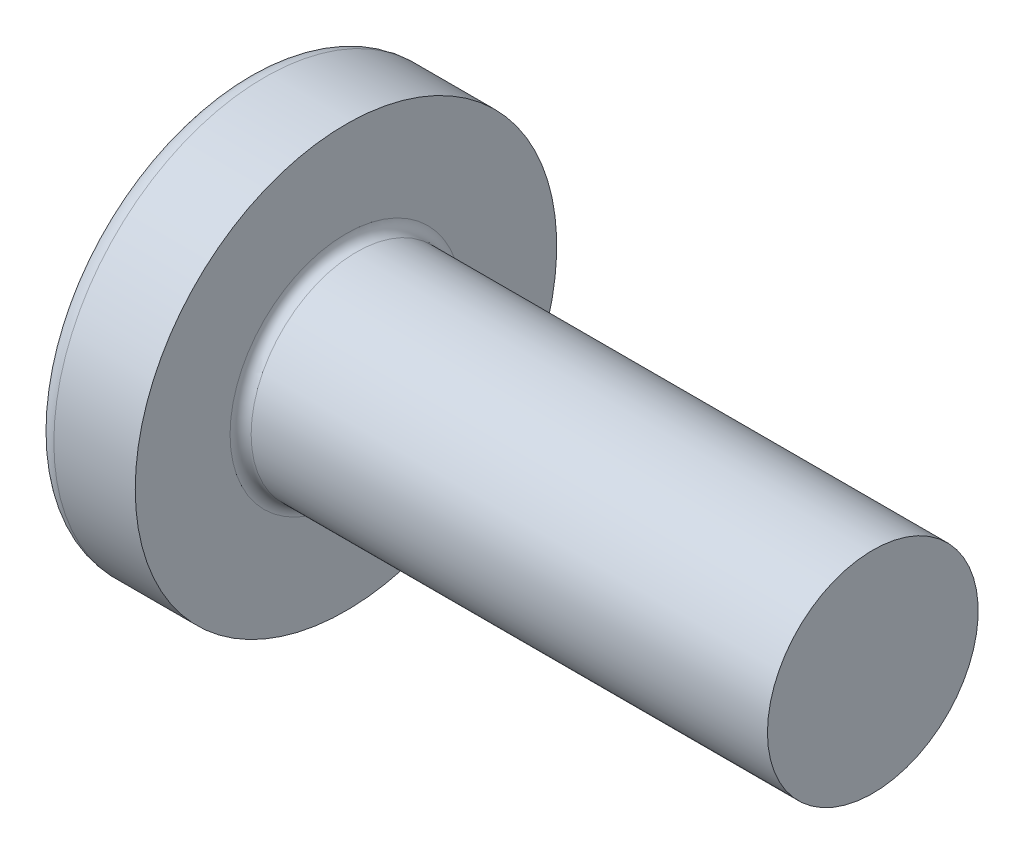
ISO-10303-21;
HEADER;
FILE_DESCRIPTION(('STEP AP214'),'2;1');
FILE_NAME('part.step','',(''),(''),'','','');
FILE_SCHEMA(('AUTOMOTIVE_DESIGN { 1 0 10303 214 1 1 1 1 }'));
ENDSEC;
DATA;
#1=APPLICATION_CONTEXT('core data for automotive mechanical design processes');
#2=APPLICATION_PROTOCOL_DEFINITION('international standard','automotive_design',2000,#1);
#3=PRODUCT_CONTEXT('',#1,'mechanical');
#4=PRODUCT('Part','Part','',(#3));
#5=PRODUCT_RELATED_PRODUCT_CATEGORY('part','',(#4));
#6=PRODUCT_DEFINITION_FORMATION('','',#4);
#7=PRODUCT_DEFINITION_CONTEXT('part definition',#1,'design');
#8=PRODUCT_DEFINITION('design','',#6,#7);
#9=PRODUCT_DEFINITION_SHAPE('','',#8);
#10=(LENGTH_UNIT() NAMED_UNIT(*) SI_UNIT(.MILLI.,.METRE.));
#11=(NAMED_UNIT(*) PLANE_ANGLE_UNIT() SI_UNIT($,.RADIAN.));
#12=(NAMED_UNIT(*) SI_UNIT($,.STERADIAN.) SOLID_ANGLE_UNIT());
#13=UNCERTAINTY_MEASURE_WITH_UNIT(LENGTH_MEASURE(1.E-05),#10,'distance_accuracy_value','');
#14=(GEOMETRIC_REPRESENTATION_CONTEXT(3) GLOBAL_UNCERTAINTY_ASSIGNED_CONTEXT((#13)) GLOBAL_UNIT_ASSIGNED_CONTEXT((#10,
#11,#12)) REPRESENTATION_CONTEXT('',''));
#15=CARTESIAN_POINT('',(0.,0.,0.));
#16=DIRECTION('',(0.,0.,1.));
#17=DIRECTION('',(1.,0.,0.));
#18=AXIS2_PLACEMENT_3D('',#15,#16,#17);
#19=CARTESIAN_POINT('',(6.5,0.,0.));
#20=DIRECTION('',(-1.,0.,0.));
#21=DIRECTION('',(0.,1.,0.));
#22=AXIS2_PLACEMENT_3D('',#19,#20,#21);
#23=SPHERICAL_SURFACE('',#22,6.5);
#24=CARTESIAN_POINT('',(1.26538895452803,0.,0.));
#25=DIRECTION('',(-1.,0.,0.));
#26=DIRECTION('',(0.,0.,1.));
#27=AXIS2_PLACEMENT_3D('',#24,#25,#26);
#28=CIRCLE('',#27,3.85342019543974);
#29=CARTESIAN_POINT('',(1.26538895452803,0.,3.85342019543974));
#30=VERTEX_POINT('',#29);
#31=EDGE_CURVE('E209',#30,#30,#28,.T.);
#32=ORIENTED_EDGE('',*,*,#31,.T.);
#33=EDGE_LOOP('',(#32));
#34=FACE_BOUND('',#33,.T.);
#35=CARTESIAN_POINT('',(0.0788099820016241,0.,0.));
#36=DIRECTION('',(1.,0.,0.));
#37=DIRECTION('',(0.,0.,-1.));
#38=AXIS2_PLACEMENT_3D('',#35,#36,#37);
#39=CIRCLE('',#38,1.0091178091571);
#40=CARTESIAN_POINT('',(0.0788099820016234,-0.514999999999996,-0.867809744562726));
#41=VERTEX_POINT('',#40);
#42=CARTESIAN_POINT('',(0.0788099820016241,-0.867809744562728,-0.515));
#43=VERTEX_POINT('',#42);
#44=EDGE_CURVE('E398',#41,#43,#39,.F.);
#45=ORIENTED_EDGE('',*,*,#44,.F.);
#46=CARTESIAN_POINT('',(6.5,-0.515000000000001,0.));
#47=DIRECTION('',(0.,1.,0.));
#48=DIRECTION('',(0.,0.,1.));
#49=AXIS2_PLACEMENT_3D('',#46,#47,#48);
#50=CIRCLE('',#49,6.47956595768575);
#51=CARTESIAN_POINT('',(0.331830514069449,-0.514999999999992,-1.98455541440274));
#52=VERTEX_POINT('',#51);
#53=EDGE_CURVE('E254',#52,#41,#50,.T.);
#54=ORIENTED_EDGE('',*,*,#53,.F.);
#55=CARTESIAN_POINT('',(6.06443205224295,0.,0.873614180207961));
#56=DIRECTION('',(0.446197800778958,0.,-0.89493436774996));
#57=DIRECTION('',(-0.89493436774996,0.,-0.446197800778958));
#58=AXIS2_PLACEMENT_3D('',#55,#56,#57);
#59=CIRCLE('',#58,6.4262803258982);
#60=CARTESIAN_POINT('',(0.331830514069448,0.515000000000007,-1.98455541440274));
#61=VERTEX_POINT('',#60);
#62=EDGE_CURVE('E228',#52,#61,#59,.T.);
#63=ORIENTED_EDGE('',*,*,#62,.T.);
#64=CARTESIAN_POINT('',(6.5,0.515,0.));
#65=DIRECTION('',(0.,-1.,0.));
#66=DIRECTION('',(0.,0.,-1.));
#67=AXIS2_PLACEMENT_3D('',#64,#65,#66);
#68=CIRCLE('',#67,6.47956595768574);
#69=CARTESIAN_POINT('',(0.0788099820016247,0.515000000000003,-0.867809744562722));
#70=VERTEX_POINT('',#69);
#71=EDGE_CURVE('E262',#70,#61,#68,.T.);
#72=ORIENTED_EDGE('',*,*,#71,.F.);
#73=CARTESIAN_POINT('',(0.0788099820016241,0.867809744562718,-0.515));
#74=VERTEX_POINT('',#73);
#75=EDGE_CURVE('E330',#74,#70,#39,.F.);
#76=ORIENTED_EDGE('',*,*,#75,.F.);
#77=CARTESIAN_POINT('',(6.5,0.,-0.515));
#78=DIRECTION('',(0.,0.,1.));
#79=DIRECTION('',(1.,0.,0.));
#80=AXIS2_PLACEMENT_3D('',#77,#78,#79);
#81=CIRCLE('',#80,6.47956595768574);
#82=CARTESIAN_POINT('',(0.331830514069449,1.98455541440274,-0.515));
#83=VERTEX_POINT('',#82);
#84=EDGE_CURVE('E222',#83,#74,#81,.T.);
#85=ORIENTED_EDGE('',*,*,#84,.F.);
#86=CARTESIAN_POINT('',(6.06443205224295,-0.873614180207962,0.));
#87=DIRECTION('',(0.446197800778958,0.89493436774996,0.));
#88=DIRECTION('',(-0.89493436774996,0.446197800778958,0.));
#89=AXIS2_PLACEMENT_3D('',#86,#87,#88);
#90=CIRCLE('',#89,6.4262803258982);
#91=CARTESIAN_POINT('',(0.331830514069449,1.98455541440274,0.515));
#92=VERTEX_POINT('',#91);
#93=EDGE_CURVE('E225',#83,#92,#90,.T.);
#94=ORIENTED_EDGE('',*,*,#93,.T.);
#95=CARTESIAN_POINT('',(6.5,0.,0.515));
#96=DIRECTION('',(0.,0.,-1.));
#97=DIRECTION('',(-1.,0.,0.));
#98=AXIS2_PLACEMENT_3D('',#95,#96,#97);
#99=CIRCLE('',#98,6.47956595768574);
#100=CARTESIAN_POINT('',(0.0788099820016241,0.867809744562718,0.514999999999999));
#101=VERTEX_POINT('',#100);
#102=EDGE_CURVE('E218',#101,#92,#99,.T.);
#103=ORIENTED_EDGE('',*,*,#102,.F.);
#104=CARTESIAN_POINT('',(0.0788099820016251,0.514999999999997,0.867809744562726));
#105=VERTEX_POINT('',#104);
#106=EDGE_CURVE('E360',#105,#101,#39,.F.);
#107=ORIENTED_EDGE('',*,*,#106,.F.);
#108=CARTESIAN_POINT('',(0.331830514069448,0.514999999999993,1.98455541440274));
#109=VERTEX_POINT('',#108);
#110=EDGE_CURVE('E238',#109,#105,#68,.T.);
#111=ORIENTED_EDGE('',*,*,#110,.F.);
#112=CARTESIAN_POINT('',(6.06443205224295,0.,-0.873614180207961));
#113=DIRECTION('',(0.446197800778958,0.,0.89493436774996));
#114=DIRECTION('',(0.89493436774996,0.,-0.446197800778958));
#115=AXIS2_PLACEMENT_3D('',#112,#113,#114);
#116=CIRCLE('',#115,6.4262803258982);
#117=CARTESIAN_POINT('',(0.331830514069448,-0.515000000000007,1.98455541440274));
#118=VERTEX_POINT('',#117);
#119=EDGE_CURVE('E46',#109,#118,#116,.T.);
#120=ORIENTED_EDGE('',*,*,#119,.T.);
#121=CARTESIAN_POINT('',(0.0788099820016234,-0.515000000000003,0.867809744562723));
#122=VERTEX_POINT('',#121);
#123=EDGE_CURVE('E235',#122,#118,#50,.T.);
#124=ORIENTED_EDGE('',*,*,#123,.F.);
#125=CARTESIAN_POINT('',(0.0788099820016241,-0.867809744562728,0.514999999999999));
#126=VERTEX_POINT('',#125);
#127=EDGE_CURVE('E394',#126,#122,#39,.F.);
#128=ORIENTED_EDGE('',*,*,#127,.F.);
#129=CARTESIAN_POINT('',(0.331830514069448,-1.98455541440274,0.514999999999999));
#130=VERTEX_POINT('',#129);
#131=EDGE_CURVE('E219',#130,#126,#99,.T.);
#132=ORIENTED_EDGE('',*,*,#131,.F.);
#133=CARTESIAN_POINT('',(6.06443205224295,0.87361418020796,0.));
#134=DIRECTION('',(0.446197800778958,-0.89493436774996,0.));
#135=DIRECTION('',(0.89493436774996,0.446197800778958,0.));
#136=AXIS2_PLACEMENT_3D('',#133,#134,#135);
#137=CIRCLE('',#136,6.4262803258982);
#138=CARTESIAN_POINT('',(0.331830514069447,-1.98455541440274,-0.515));
#139=VERTEX_POINT('',#138);
#140=EDGE_CURVE('E215',#130,#139,#137,.T.);
#141=ORIENTED_EDGE('',*,*,#140,.T.);
#142=EDGE_CURVE('E61',#43,#139,#81,.T.);
#143=ORIENTED_EDGE('',*,*,#142,.F.);
#144=EDGE_LOOP('',(#45,#54,#63,#72,#76,#85,#94,#103,#107,#111,#120,#124,#128,#132,#141,#143));
#145=FACE_BOUND('',#144,.T.);
#146=ADVANCED_FACE('F33',(#34,#145),#23,.T.);
#147=CARTESIAN_POINT('',(0.,2.15,-0.515));
#148=DIRECTION('',(0.,0.,1.));
#149=DIRECTION('',(1.,0.,0.));
#150=AXIS2_PLACEMENT_3D('',#147,#148,#149);
#151=PLANE('',#150);
#152=ORIENTED_EDGE('',*,*,#84,.T.);
#153=CARTESIAN_POINT('',(-1.51195208675156,0.994972220320186,-0.515));
#154=CARTESIAN_POINT('',(-1.20405981949279,0.970722016949956,-0.515));
#155=CARTESIAN_POINT('',(-0.896180907521171,0.946299109919649,-0.515));
#156=CARTESIAN_POINT('',(-0.280449079832184,0.89698112242785,-0.515));
#157=CARTESIAN_POINT('',(0.0274038344396877,0.872086023934881,-0.515));
#158=CARTESIAN_POINT('',(0.489146739515351,0.834295535195278,-0.515));
#159=CARTESIAN_POINT('',(0.643055047553846,0.821624058404091,-0.515));
#160=CARTESIAN_POINT('',(0.95085652019714,0.796108332639503,-0.515));
#161=CARTESIAN_POINT('',(1.10474968487868,0.783264084592464,-0.515));
#162=CARTESIAN_POINT('',(1.41251352095103,0.757376569093377,-0.515));
#163=CARTESIAN_POINT('',(1.56638419296577,0.744333309065217,-0.515));
#164=CARTESIAN_POINT('',(1.87410847343335,0.718013273188894,-0.515));
#165=CARTESIAN_POINT('',(2.02796208151372,0.70473649298279,-0.515));
#166=CARTESIAN_POINT('',(2.36455311890988,0.675386943006725,-0.515));
#167=CARTESIAN_POINT('',(2.54728562293342,0.659257575640984,-0.515));
#168=CARTESIAN_POINT('',(2.91270624109256,0.626517182479886,-0.515));
#169=CARTESIAN_POINT('',(3.09539435554037,0.609906160177237,-0.515));
#170=CARTESIAN_POINT('',(3.46069832191612,0.57607302711642,-0.515));
#171=CARTESIAN_POINT('',(3.64331417870068,0.558850968932726,-0.515));
#172=CARTESIAN_POINT('',(4.00847437496567,0.523604864540035,-0.515));
#173=CARTESIAN_POINT('',(4.19101871216888,0.505580794604251,-0.515));
#174=CARTESIAN_POINT('',(4.55606208157937,0.468429191666486,-0.515));
#175=CARTESIAN_POINT('',(4.73856107358022,0.449301262281852,-0.515));
#176=CARTESIAN_POINT('',(5.10337547353418,0.409473604748923,-0.515));
#177=CARTESIAN_POINT('',(5.28569089526422,0.388774005106068,-0.515));
#178=CARTESIAN_POINT('',(5.55897278495412,0.355828287527262,-0.515));
#179=CARTESIAN_POINT('',(5.65005277419686,0.344527918782736,-0.515));
#180=CARTESIAN_POINT('',(5.83209904103607,0.321075174263029,-0.515));
#181=CARTESIAN_POINT('',(5.92306532397915,0.308922840209684,-0.515));
#182=CARTESIAN_POINT('',(6.10486078872898,0.283427334451928,-0.515));
#183=CARTESIAN_POINT('',(6.19568992299379,0.270083817601712,-0.515));
#184=CARTESIAN_POINT('',(6.33172773785679,0.248701420809948,-0.515));
#185=CARTESIAN_POINT('',(6.37704304473344,0.241345446705302,-0.515));
#186=CARTESIAN_POINT('',(6.46757225201409,0.226018953559335,-0.515));
#187=CARTESIAN_POINT('',(6.51278614568082,0.218048394864474,-0.515));
#188=CARTESIAN_POINT('',(6.55793125759548,0.209691465274942,-0.515));
#189=B_SPLINE_CURVE_WITH_KNOTS('',3,(#153,#154,#155,#156,#157,#158,#159,#160,#161,#162,#163,
#164,#165,#166,#167,#168,#169,#170,#171,#172,#173,#174,#175,#176,#177,#178,#179,#180,#181,#182,
#183,#184,#185,#186,#187,#188),.UNSPECIFIED.,.F.,.F.,(4,2,2,2,2,2,2,2,2,2,2,2,2,2,2,2,2,4),(0.,
0.92653770978172,1.85311087258339,2.31639796016284,2.7796825646877,3.24294992902054,
3.70622594801777,4.25655436065378,4.80687878359543,5.35715597005738,5.90744944680717,
6.45794177197673,7.00838913527399,7.28372117336898,7.5590397375059,7.83443833587748,
7.97216007460854,8.1098907067157),.UNSPECIFIED.);
#190=CARTESIAN_POINT('',(2.34,0.677477674908921,-0.515));
#191=VERTEX_POINT('',#190);
#192=EDGE_CURVE('E323',#74,#191,#189,.T.);
#193=ORIENTED_EDGE('',*,*,#192,.T.);
#194=DIRECTION('',(0.,1.,0.));
#195=VECTOR('',#194,1.);
#196=CARTESIAN_POINT('',(2.34,-0.983319077411408,-0.515));
#197=LINE('',#196,#195);
#198=CARTESIAN_POINT('',(2.34,0.983319077411408,-0.515));
#199=VERTEX_POINT('',#198);
#200=EDGE_CURVE('E277',#191,#199,#197,.T.);
#201=ORIENTED_EDGE('',*,*,#200,.T.);
#202=DIRECTION('',(0.89493436774996,-0.446197800778958,0.));
#203=VECTOR('',#202,1.);
#204=CARTESIAN_POINT('',(0.,2.15,-0.515));
#205=LINE('',#204,#203);
#206=EDGE_CURVE('E283',#83,#199,#205,.T.);
#207=ORIENTED_EDGE('',*,*,#206,.F.);
#208=EDGE_LOOP('',(#152,#193,#201,#207));
#209=FACE_BOUND('',#208,.T.);
#210=ADVANCED_FACE('F167',(#209),#151,.T.);
#211=CARTESIAN_POINT('',(2.34,-0.983319077411408,-0.515));
#212=VERTEX_POINT('',#211);
#213=CARTESIAN_POINT('',(2.34,-0.677477674908921,-0.515));
#214=VERTEX_POINT('',#213);
#215=EDGE_CURVE('E274',#212,#214,#197,.T.);
#216=ORIENTED_EDGE('',*,*,#215,.T.);
#217=CARTESIAN_POINT('',(-1.51195208675156,-0.994972220320186,-0.515));
#218=CARTESIAN_POINT('',(-1.20405981949279,-0.970722016949956,-0.515));
#219=CARTESIAN_POINT('',(-0.896180907521173,-0.946299109919649,-0.515));
#220=CARTESIAN_POINT('',(-0.280449079832185,-0.89698112242785,-0.515));
#221=CARTESIAN_POINT('',(0.0274038344396871,-0.872086023934881,-0.515));
#222=CARTESIAN_POINT('',(0.48914673951535,-0.834295535195279,-0.515));
#223=CARTESIAN_POINT('',(0.643055047553845,-0.821624058404091,-0.515));
#224=CARTESIAN_POINT('',(0.95085652019714,-0.796108332639502,-0.515));
#225=CARTESIAN_POINT('',(1.10474968487868,-0.783264084592464,-0.515));
#226=CARTESIAN_POINT('',(1.41251352095103,-0.757376569093377,-0.515));
#227=CARTESIAN_POINT('',(1.56638419296577,-0.744333309065217,-0.515));
#228=CARTESIAN_POINT('',(1.87410847343335,-0.718013273188894,-0.515));
#229=CARTESIAN_POINT('',(2.02796208151372,-0.70473649298279,-0.515));
#230=CARTESIAN_POINT('',(2.36455311890988,-0.675386943006725,-0.515));
#231=CARTESIAN_POINT('',(2.54728562293341,-0.659257575640984,-0.515));
#232=CARTESIAN_POINT('',(2.91270624109255,-0.626517182479886,-0.515));
#233=CARTESIAN_POINT('',(3.09539435554037,-0.609906160177237,-0.515));
#234=CARTESIAN_POINT('',(3.46069832191612,-0.57607302711642,-0.515));
#235=CARTESIAN_POINT('',(3.64331417870068,-0.558850968932726,-0.515));
#236=CARTESIAN_POINT('',(4.00847437496567,-0.523604864540036,-0.515));
#237=CARTESIAN_POINT('',(4.19101871216888,-0.505580794604251,-0.515));
#238=CARTESIAN_POINT('',(4.55606208157937,-0.468429191666486,-0.515));
#239=CARTESIAN_POINT('',(4.73856107358022,-0.449301262281852,-0.515));
#240=CARTESIAN_POINT('',(5.10337547353418,-0.409473604748923,-0.515));
#241=CARTESIAN_POINT('',(5.28569089526422,-0.388774005106068,-0.515));
#242=CARTESIAN_POINT('',(5.55897278495412,-0.355828287527262,-0.515));
#243=CARTESIAN_POINT('',(5.65005277419686,-0.344527918782736,-0.515));
#244=CARTESIAN_POINT('',(5.83209904103607,-0.321075174263029,-0.515));
#245=CARTESIAN_POINT('',(5.92306532397915,-0.308922840209684,-0.515));
#246=CARTESIAN_POINT('',(6.10486078872898,-0.283427334451928,-0.515));
#247=CARTESIAN_POINT('',(6.19568992299379,-0.270083817601712,-0.515));
#248=CARTESIAN_POINT('',(6.33172773785679,-0.248701420809948,-0.515));
#249=CARTESIAN_POINT('',(6.37704304473344,-0.241345446705301,-0.515));
#250=CARTESIAN_POINT('',(6.4675722520141,-0.226018953559335,-0.515));
#251=CARTESIAN_POINT('',(6.51278614568083,-0.218048394864473,-0.515));
#252=CARTESIAN_POINT('',(6.55793125759548,-0.209691465274942,-0.515));
#253=B_SPLINE_CURVE_WITH_KNOTS('',3,(#217,#218,#219,#220,#221,#222,#223,#224,#225,#226,#227,
#228,#229,#230,#231,#232,#233,#234,#235,#236,#237,#238,#239,#240,#241,#242,#243,#244,#245,#246,
#247,#248,#249,#250,#251,#252),.UNSPECIFIED.,.F.,.F.,(4,2,2,2,2,2,2,2,2,2,2,2,2,2,2,2,2,4),(0.,
0.926537709781719,1.85311087258339,2.31639796016284,2.7796825646877,3.24294992902054,
3.70622594801777,4.25655436065378,4.80687878359543,5.35715597005738,5.90744944680717,
6.45794177197673,7.00838913527399,7.28372117336898,7.5590397375059,7.83443833587748,
7.97216007460854,8.10989070671571),.UNSPECIFIED.);
#254=EDGE_CURVE('E316',#214,#43,#253,.F.);
#255=ORIENTED_EDGE('',*,*,#254,.T.);
#256=ORIENTED_EDGE('',*,*,#142,.T.);
#257=DIRECTION('',(0.89493436774996,0.446197800778958,0.));
#258=VECTOR('',#257,1.);
#259=CARTESIAN_POINT('',(0.,-2.15,-0.515));
#260=LINE('',#259,#258);
#261=EDGE_CURVE('E280',#139,#212,#260,.T.);
#262=ORIENTED_EDGE('',*,*,#261,.T.);
#263=EDGE_LOOP('',(#216,#255,#256,#262));
#264=FACE_BOUND('',#263,.T.);
#265=ADVANCED_FACE('F173',(#264),#151,.T.);
#266=CARTESIAN_POINT('',(0.,-2.15,0.514999999999999));
#267=DIRECTION('',(0.,0.,-1.));
#268=DIRECTION('',(-1.,0.,0.));
#269=AXIS2_PLACEMENT_3D('',#266,#267,#268);
#270=PLANE('',#269);
#271=DIRECTION('',(0.,-1.,0.));
#272=VECTOR('',#271,1.);
#273=CARTESIAN_POINT('',(2.34,0.983319077411408,0.515));
#274=LINE('',#273,#272);
#275=CARTESIAN_POINT('',(2.34,0.983319077411408,0.515));
#276=VERTEX_POINT('',#275);
#277=CARTESIAN_POINT('',(2.34,0.677477674908921,0.515));
#278=VERTEX_POINT('',#277);
#279=EDGE_CURVE('E267',#276,#278,#274,.T.);
#280=ORIENTED_EDGE('',*,*,#279,.T.);
#281=CARTESIAN_POINT('',(-1.51195208675156,0.994972220320186,0.514999999999999));
#282=CARTESIAN_POINT('',(-1.20405981949279,0.970722016949957,0.514999999999999));
#283=CARTESIAN_POINT('',(-0.896180907521172,0.94629910991965,0.514999999999999));
#284=CARTESIAN_POINT('',(-0.280449079832184,0.89698112242785,0.514999999999999));
#285=CARTESIAN_POINT('',(0.0274038344396879,0.872086023934882,0.514999999999999));
#286=CARTESIAN_POINT('',(0.489146739515351,0.834295535195279,0.515));
#287=CARTESIAN_POINT('',(0.643055047553846,0.821624058404091,0.515));
#288=CARTESIAN_POINT('',(0.95085652019714,0.796108332639503,0.515));
#289=CARTESIAN_POINT('',(1.10474968487868,0.783264084592464,0.515));
#290=CARTESIAN_POINT('',(1.41251352095103,0.757376569093377,0.515));
#291=CARTESIAN_POINT('',(1.56638419296577,0.744333309065217,0.515));
#292=CARTESIAN_POINT('',(1.87410847343335,0.718013273188894,0.515));
#293=CARTESIAN_POINT('',(2.02796208151372,0.704736492982791,0.515));
#294=CARTESIAN_POINT('',(2.36455311890988,0.675386943006725,0.515));
#295=CARTESIAN_POINT('',(2.54728562293341,0.659257575640984,0.515));
#296=CARTESIAN_POINT('',(2.91270624109255,0.626517182479886,0.515));
#297=CARTESIAN_POINT('',(3.09539435554037,0.609906160177237,0.515));
#298=CARTESIAN_POINT('',(3.46069832191612,0.57607302711642,0.515));
#299=CARTESIAN_POINT('',(3.64331417870068,0.558850968932726,0.515));
#300=CARTESIAN_POINT('',(4.00847437496567,0.523604864540036,0.515));
#301=CARTESIAN_POINT('',(4.19101871216888,0.505580794604251,0.515));
#302=CARTESIAN_POINT('',(4.55606208157937,0.468429191666486,0.515));
#303=CARTESIAN_POINT('',(4.73856107358022,0.449301262281852,0.515));
#304=CARTESIAN_POINT('',(5.10337547353418,0.409473604748922,0.515));
#305=CARTESIAN_POINT('',(5.28569089526422,0.388774005106067,0.515));
#306=CARTESIAN_POINT('',(5.55897278495411,0.355828287527262,0.515));
#307=CARTESIAN_POINT('',(5.65005277419685,0.344527918782736,0.515));
#308=CARTESIAN_POINT('',(5.83209904103607,0.321075174263028,0.515));
#309=CARTESIAN_POINT('',(5.92306532397915,0.308922840209683,0.515));
#310=CARTESIAN_POINT('',(6.10486078872898,0.283427334451927,0.515));
#311=CARTESIAN_POINT('',(6.19568992299379,0.270083817601711,0.515000000000001));
#312=CARTESIAN_POINT('',(6.33172773785679,0.248701420809947,0.515000000000001));
#313=CARTESIAN_POINT('',(6.37704304473344,0.2413454467053,0.515000000000001));
#314=CARTESIAN_POINT('',(6.4675722520141,0.226018953559334,0.515000000000001));
#315=CARTESIAN_POINT('',(6.51278614568082,0.218048394864472,0.515000000000001));
#316=CARTESIAN_POINT('',(6.55793125759548,0.209691465274941,0.515000000000001));
#317=B_SPLINE_CURVE_WITH_KNOTS('',3,(#281,#282,#283,#284,#285,#286,#287,#288,#289,#290,#291,
#292,#293,#294,#295,#296,#297,#298,#299,#300,#301,#302,#303,#304,#305,#306,#307,#308,#309,#310,
#311,#312,#313,#314,#315,#316),.UNSPECIFIED.,.F.,.F.,(4,2,2,2,2,2,2,2,2,2,2,2,2,2,2,2,2,4),(0.,
0.92653770978172,1.85311087258339,2.31639796016284,2.7796825646877,3.24294992902054,
3.70622594801777,4.25655436065377,4.80687878359543,5.35715597005738,5.90744944680717,
6.45794177197673,7.00838913527399,7.28372117336898,7.5590397375059,7.83443833587748,
7.97216007460854,8.10989070671571),.UNSPECIFIED.);
#318=EDGE_CURVE('E361',#278,#101,#317,.F.);
#319=ORIENTED_EDGE('',*,*,#318,.T.);
#320=ORIENTED_EDGE('',*,*,#102,.T.);
#321=DIRECTION('',(0.89493436774996,-0.446197800778958,0.));
#322=VECTOR('',#321,1.);
#323=CARTESIAN_POINT('',(0.,2.15,0.515));
#324=LINE('',#323,#322);
#325=EDGE_CURVE('E282',#92,#276,#324,.T.);
#326=ORIENTED_EDGE('',*,*,#325,.T.);
#327=EDGE_LOOP('',(#280,#319,#320,#326));
#328=FACE_BOUND('',#327,.T.);
#329=ADVANCED_FACE('F311',(#328),#270,.T.);
#330=ORIENTED_EDGE('',*,*,#131,.T.);
#331=CARTESIAN_POINT('',(-1.51195208675156,-0.994972220320186,0.514999999999999));
#332=CARTESIAN_POINT('',(-1.20405981949279,-0.970722016949957,0.514999999999999));
#333=CARTESIAN_POINT('',(-0.896180907521172,-0.94629910991965,0.514999999999999));
#334=CARTESIAN_POINT('',(-0.280449079832185,-0.89698112242785,0.514999999999999));
#335=CARTESIAN_POINT('',(0.027403834439687,-0.872086023934882,0.514999999999999));
#336=CARTESIAN_POINT('',(0.48914673951535,-0.834295535195279,0.514999999999999));
#337=CARTESIAN_POINT('',(0.643055047553845,-0.821624058404091,0.514999999999999));
#338=CARTESIAN_POINT('',(0.95085652019714,-0.796108332639503,0.514999999999999));
#339=CARTESIAN_POINT('',(1.10474968487868,-0.783264084592464,0.515));
#340=CARTESIAN_POINT('',(1.41251352095103,-0.757376569093377,0.515));
#341=CARTESIAN_POINT('',(1.56638419296577,-0.744333309065217,0.515));
#342=CARTESIAN_POINT('',(1.87410847343335,-0.718013273188895,0.515));
#343=CARTESIAN_POINT('',(2.02796208151372,-0.704736492982791,0.515));
#344=CARTESIAN_POINT('',(2.36455311890988,-0.675386943006725,0.515));
#345=CARTESIAN_POINT('',(2.54728562293341,-0.659257575640985,0.515));
#346=CARTESIAN_POINT('',(2.91270624109255,-0.626517182479887,0.515));
#347=CARTESIAN_POINT('',(3.09539435554037,-0.609906160177237,0.515));
#348=CARTESIAN_POINT('',(3.46069832191612,-0.57607302711642,0.515));
#349=CARTESIAN_POINT('',(3.64331417870068,-0.558850968932726,0.515));
#350=CARTESIAN_POINT('',(4.00847437496567,-0.523604864540036,0.515));
#351=CARTESIAN_POINT('',(4.19101871216888,-0.505580794604251,0.515));
#352=CARTESIAN_POINT('',(4.55606208157937,-0.468429191666486,0.515));
#353=CARTESIAN_POINT('',(4.73856107358022,-0.449301262281852,0.515));
#354=CARTESIAN_POINT('',(5.10337547353418,-0.409473604748922,0.515));
#355=CARTESIAN_POINT('',(5.28569089526422,-0.388774005106067,0.515));
#356=CARTESIAN_POINT('',(5.55897278495411,-0.355828287527262,0.515));
#357=CARTESIAN_POINT('',(5.65005277419685,-0.344527918782736,0.515));
#358=CARTESIAN_POINT('',(5.83209904103607,-0.321075174263029,0.515));
#359=CARTESIAN_POINT('',(5.92306532397915,-0.308922840209683,0.515));
#360=CARTESIAN_POINT('',(6.10486078872897,-0.283427334451927,0.515));
#361=CARTESIAN_POINT('',(6.19568992299379,-0.270083817601711,0.515));
#362=CARTESIAN_POINT('',(6.33172773785679,-0.248701420809948,0.515));
#363=CARTESIAN_POINT('',(6.37704304473344,-0.241345446705301,0.515));
#364=CARTESIAN_POINT('',(6.4675722520141,-0.226018953559334,0.515));
#365=CARTESIAN_POINT('',(6.51278614568082,-0.218048394864473,0.515));
#366=CARTESIAN_POINT('',(6.55793125759548,-0.209691465274941,0.515));
#367=B_SPLINE_CURVE_WITH_KNOTS('',3,(#331,#332,#333,#334,#335,#336,#337,#338,#339,#340,#341,
#342,#343,#344,#345,#346,#347,#348,#349,#350,#351,#352,#353,#354,#355,#356,#357,#358,#359,#360,
#361,#362,#363,#364,#365,#366),.UNSPECIFIED.,.F.,.F.,(4,2,2,2,2,2,2,2,2,2,2,2,2,2,2,2,2,4),(0.,
0.92653770978172,1.85311087258339,2.31639796016284,2.7796825646877,3.24294992902054,
3.70622594801777,4.25655436065378,4.80687878359543,5.35715597005738,5.90744944680717,
6.45794177197673,7.00838913527399,7.28372117336898,7.5590397375059,7.83443833587748,
7.97216007460854,8.1098907067157),.UNSPECIFIED.);
#368=CARTESIAN_POINT('',(2.34,-0.677477674908921,0.515));
#369=VERTEX_POINT('',#368);
#370=EDGE_CURVE('E351',#126,#369,#367,.T.);
#371=ORIENTED_EDGE('',*,*,#370,.T.);
#372=CARTESIAN_POINT('',(2.34,-0.983319077411408,0.515));
#373=VERTEX_POINT('',#372);
#374=EDGE_CURVE('E270',#369,#373,#274,.T.);
#375=ORIENTED_EDGE('',*,*,#374,.T.);
#376=DIRECTION('',(0.89493436774996,0.446197800778958,0.));
#377=VECTOR('',#376,1.);
#378=CARTESIAN_POINT('',(0.,-2.15,0.514999999999999));
#379=LINE('',#378,#377);
#380=EDGE_CURVE('E266',#130,#373,#379,.T.);
#381=ORIENTED_EDGE('',*,*,#380,.F.);
#382=EDGE_LOOP('',(#330,#371,#375,#381));
#383=FACE_BOUND('',#382,.T.);
#384=ADVANCED_FACE('F379',(#383),#270,.T.);
#385=CARTESIAN_POINT('',(2.34,0.983319077411408,-0.515));
#386=DIRECTION('',(-1.,0.,0.));
#387=DIRECTION('',(0.,0.,1.));
#388=AXIS2_PLACEMENT_3D('',#385,#386,#387);
#389=PLANE('',#388);
#390=ORIENTED_EDGE('',*,*,#374,.F.);
#391=CARTESIAN_POINT('',(2.34,0.,0.));
#392=DIRECTION('',(-1.,0.,0.));
#393=DIRECTION('',(0.,0.,1.));
#394=AXIS2_PLACEMENT_3D('',#391,#392,#393);
#395=CIRCLE('',#394,0.850999999999999);
#396=EDGE_CURVE('E393',#214,#369,#395,.T.);
#397=ORIENTED_EDGE('',*,*,#396,.F.);
#398=ORIENTED_EDGE('',*,*,#215,.F.);
#399=DIRECTION('',(0.,0.,1.));
#400=VECTOR('',#399,1.);
#401=CARTESIAN_POINT('',(2.34,-0.983319077411408,-0.515));
#402=LINE('',#401,#400);
#403=EDGE_CURVE('E263',#212,#373,#402,.T.);
#404=ORIENTED_EDGE('',*,*,#403,.T.);
#405=EDGE_LOOP('',(#390,#397,#398,#404));
#406=FACE_BOUND('',#405,.T.);
#407=ADVANCED_FACE('F376',(#406),#389,.T.);
#408=DIRECTION('',(0.,0.,-1.));
#409=VECTOR('',#408,1.);
#410=CARTESIAN_POINT('',(2.34,-0.515000000000003,0.983319077411407));
#411=LINE('',#410,#409);
#412=CARTESIAN_POINT('',(2.34,-0.514999999999997,-0.677477674908923));
#413=VERTEX_POINT('',#412);
#414=CARTESIAN_POINT('',(2.34,-0.514999999999996,-0.98331907741141));
#415=VERTEX_POINT('',#414);
#416=EDGE_CURVE('E420',#413,#415,#411,.T.);
#417=ORIENTED_EDGE('',*,*,#416,.F.);
#418=CARTESIAN_POINT('',(2.34,0.515000000000002,-0.677477674908919));
#419=VERTEX_POINT('',#418);
#420=EDGE_CURVE('E53',#419,#413,#395,.T.);
#421=ORIENTED_EDGE('',*,*,#420,.F.);
#422=DIRECTION('',(0.,0.,1.));
#423=VECTOR('',#422,1.);
#424=CARTESIAN_POINT('',(2.34,0.515000000000004,-0.983319077411407));
#425=LINE('',#424,#423);
#426=CARTESIAN_POINT('',(2.34,0.515000000000004,-0.983319077411407));
#427=VERTEX_POINT('',#426);
#428=EDGE_CURVE('E419',#427,#419,#425,.T.);
#429=ORIENTED_EDGE('',*,*,#428,.F.);
#430=DIRECTION('',(0.,-1.,0.));
#431=VECTOR('',#430,1.);
#432=CARTESIAN_POINT('',(2.34,0.515000000000004,-0.983319077411407));
#433=LINE('',#432,#431);
#434=EDGE_CURVE('E432',#427,#415,#433,.T.);
#435=ORIENTED_EDGE('',*,*,#434,.T.);
#436=EDGE_LOOP('',(#417,#421,#429,#435));
#437=FACE_BOUND('',#436,.T.);
#438=ADVANCED_FACE('F378',(#437),#389,.T.);
#439=ORIENTED_EDGE('',*,*,#200,.F.);
#440=EDGE_CURVE('E403',#278,#191,#395,.T.);
#441=ORIENTED_EDGE('',*,*,#440,.F.);
#442=ORIENTED_EDGE('',*,*,#279,.F.);
#443=DIRECTION('',(0.,0.,-1.));
#444=VECTOR('',#443,1.);
#445=CARTESIAN_POINT('',(2.34,0.983319077411408,0.515));
#446=LINE('',#445,#444);
#447=EDGE_CURVE('E271',#276,#199,#446,.T.);
#448=ORIENTED_EDGE('',*,*,#447,.T.);
#449=EDGE_LOOP('',(#439,#441,#442,#448));
#450=FACE_BOUND('',#449,.T.);
#451=ADVANCED_FACE('F453',(#450),#389,.T.);
#452=CARTESIAN_POINT('',(2.34,0.514999999999998,0.677477674908923));
#453=VERTEX_POINT('',#452);
#454=CARTESIAN_POINT('',(2.34,0.514999999999997,0.98331907741141));
#455=VERTEX_POINT('',#454);
#456=EDGE_CURVE('E252',#453,#455,#425,.T.);
#457=ORIENTED_EDGE('',*,*,#456,.F.);
#458=CARTESIAN_POINT('',(2.34,-0.515000000000002,0.677477674908919));
#459=VERTEX_POINT('',#458);
#460=EDGE_CURVE('E404',#459,#453,#395,.T.);
#461=ORIENTED_EDGE('',*,*,#460,.F.);
#462=CARTESIAN_POINT('',(2.34,-0.515000000000003,0.983319077411407));
#463=VERTEX_POINT('',#462);
#464=EDGE_CURVE('E435',#463,#459,#411,.T.);
#465=ORIENTED_EDGE('',*,*,#464,.F.);
#466=DIRECTION('',(0.,1.,0.));
#467=VECTOR('',#466,1.);
#468=CARTESIAN_POINT('',(2.34,-0.515000000000003,0.983319077411407));
#469=LINE('',#468,#467);
#470=EDGE_CURVE('E426',#463,#455,#469,.T.);
#471=ORIENTED_EDGE('',*,*,#470,.T.);
#472=EDGE_LOOP('',(#457,#461,#465,#471));
#473=FACE_BOUND('',#472,.T.);
#474=ADVANCED_FACE('F370',(#473),#389,.T.);
#475=CARTESIAN_POINT('',(0.,0.514999999999993,2.15));
#476=DIRECTION('',(0.,-1.,0.));
#477=DIRECTION('',(1.,0.,0.));
#478=AXIS2_PLACEMENT_3D('',#475,#476,#477);
#479=PLANE('',#478);
#480=ORIENTED_EDGE('',*,*,#110,.T.);
#481=CARTESIAN_POINT('',(-1.51195208754037,0.514999999999997,0.994972220382297));
#482=CARTESIAN_POINT('',(-1.20405982018868,0.514999999999997,0.970722017005064));
#483=CARTESIAN_POINT('',(-0.896180908124142,0.514999999999997,0.946299109967689));
#484=CARTESIAN_POINT('',(-0.280449080249312,0.514999999999997,0.896981122461527));
#485=CARTESIAN_POINT('',(0.0274038341154855,0.514999999999997,0.872086023961265));
#486=CARTESIAN_POINT('',(0.489146739371408,0.514999999999997,0.834295535207136));
#487=CARTESIAN_POINT('',(0.643055047497245,0.514999999999997,0.821624058408796));
#488=CARTESIAN_POINT('',(0.950856520315203,0.514999999999997,0.796108332629706));
#489=CARTESIAN_POINT('',(1.10474968508407,0.514999999999997,0.783264084575318));
#490=CARTESIAN_POINT('',(1.41251352133103,0.514999999999997,0.757376569061288));
#491=CARTESIAN_POINT('',(1.56638419343305,0.514999999999997,0.744333309025534));
#492=CARTESIAN_POINT('',(1.87410847407519,0.514999999999998,0.718013273133716));
#493=CARTESIAN_POINT('',(2.02796208224282,0.514999999999998,0.70473649291971));
#494=CARTESIAN_POINT('',(2.36455311972626,0.514999999999998,0.675386942934956));
#495=CARTESIAN_POINT('',(2.5472856237498,0.514999999999998,0.659257575568569));
#496=CARTESIAN_POINT('',(2.91270624190895,0.514999999999998,0.626517182406014));
#497=CARTESIAN_POINT('',(3.09539435635676,0.514999999999998,0.609906160102555));
#498=CARTESIAN_POINT('',(3.46069832273244,0.514999999999998,0.576073027039889));
#499=CARTESIAN_POINT('',(3.64331417951694,0.514999999999998,0.558850968855157));
#500=CARTESIAN_POINT('',(4.00847437578178,0.514999999999998,0.523604864460044));
#501=CARTESIAN_POINT('',(4.1910187129849,0.514999999999998,0.505580794522876));
#502=CARTESIAN_POINT('',(4.55606208239525,0.514999999999998,0.46842919158178));
#503=CARTESIAN_POINT('',(4.73856107439606,0.514999999999999,0.449301262195198));
#504=CARTESIAN_POINT('',(5.10337547434977,0.514999999999999,0.409473604657435));
#505=CARTESIAN_POINT('',(5.2856908960796,0.514999999999999,0.388774005011695));
#506=CARTESIAN_POINT('',(5.55897278576905,0.514999999999999,0.355828287427082));
#507=CARTESIAN_POINT('',(5.65005277501166,0.514999999999999,0.344527918680369));
#508=CARTESIAN_POINT('',(5.83209904185046,0.514999999999999,0.3210751741555));
#509=CARTESIAN_POINT('',(5.92306532479326,0.514999999999999,0.308922840099181));
#510=CARTESIAN_POINT('',(6.10486078954237,0.514999999999999,0.283427334334152));
#511=CARTESIAN_POINT('',(6.19568992380675,0.514999999999999,0.270083817479637));
#512=CARTESIAN_POINT('',(6.33172773866873,0.514999999999999,0.248701420679479));
#513=CARTESIAN_POINT('',(6.37704304554499,0.514999999999999,0.241345446571707));
#514=CARTESIAN_POINT('',(6.46757225282465,0.514999999999999,0.226018953418423));
#515=CARTESIAN_POINT('',(6.51278614649077,0.514999999999999,0.218048394719368));
#516=CARTESIAN_POINT('',(6.55793125840464,0.514999999999999,0.209691465124901));
#517=B_SPLINE_CURVE_WITH_KNOTS('',3,(#481,#482,#483,#484,#485,#486,#487,#488,#489,#490,#491,
#492,#493,#494,#495,#496,#497,#498,#499,#500,#501,#502,#503,#504,#505,#506,#507,#508,#509,#510,
#511,#512,#513,#514,#515,#516),.UNSPECIFIED.,.F.,.F.,(4,2,2,2,2,2,2,2,2,2,2,2,2,2,2,2,2,4),(0.,
0.926537710061276,1.85311087314258,2.31639796098493,2.77968256577269,3.24294993036837,
3.70622594962847,4.25655436226469,4.80687878520654,5.3571559716686,5.90744944841854,
6.45794177358855,7.00838913688618,7.28372117498156,7.55903973911883,7.83443833749095,
7.97216007622235,8.10989070832988),.UNSPECIFIED.);
#518=EDGE_CURVE('E356',#105,#453,#517,.T.);
#519=ORIENTED_EDGE('',*,*,#518,.T.);
#520=ORIENTED_EDGE('',*,*,#456,.T.);
#521=DIRECTION('',(0.89493436774996,0.,-0.446197800778958));
#522=VECTOR('',#521,1.);
#523=CARTESIAN_POINT('',(0.,0.514999999999993,2.15));
#524=LINE('',#523,#522);
#525=EDGE_CURVE('E245',#109,#455,#524,.T.);
#526=ORIENTED_EDGE('',*,*,#525,.F.);
#527=EDGE_LOOP('',(#480,#519,#520,#526));
#528=FACE_BOUND('',#527,.T.);
#529=ADVANCED_FACE('F249',(#528),#479,.T.);
#530=CARTESIAN_POINT('',(0.,-0.514999999999992,-2.15));
#531=DIRECTION('',(0.,1.,0.));
#532=DIRECTION('',(-1.,0.,0.));
#533=AXIS2_PLACEMENT_3D('',#530,#531,#532);
#534=PLANE('',#533);
#535=ORIENTED_EDGE('',*,*,#464,.T.);
#536=CARTESIAN_POINT('',(-1.51195208754037,-0.515000000000003,0.994972220382294));
#537=CARTESIAN_POINT('',(-1.20405982018868,-0.515000000000003,0.970722017005061));
#538=CARTESIAN_POINT('',(-0.896180908124143,-0.515000000000003,0.946299109967686));
#539=CARTESIAN_POINT('',(-0.280449080249312,-0.515000000000003,0.896981122461524));
#540=CARTESIAN_POINT('',(0.0274038341154848,-0.515000000000003,0.872086023961261));
#541=CARTESIAN_POINT('',(0.489146739371408,-0.515000000000003,0.834295535207133));
#542=CARTESIAN_POINT('',(0.643055047497244,-0.515000000000003,0.821624058408793));
#543=CARTESIAN_POINT('',(0.950856520315202,-0.515000000000003,0.796108332629702));
#544=CARTESIAN_POINT('',(1.10474968508407,-0.515000000000002,0.783264084575314));
#545=CARTESIAN_POINT('',(1.41251352133102,-0.515000000000002,0.757376569061284));
#546=CARTESIAN_POINT('',(1.56638419343305,-0.515000000000002,0.744333309025531));
#547=CARTESIAN_POINT('',(1.87410847407519,-0.515000000000002,0.718013273133713));
#548=CARTESIAN_POINT('',(2.02796208224282,-0.515000000000002,0.704736492919706));
#549=CARTESIAN_POINT('',(2.36455311972626,-0.515000000000002,0.675386942934953));
#550=CARTESIAN_POINT('',(2.5472856237498,-0.515000000000002,0.659257575568565));
#551=CARTESIAN_POINT('',(2.91270624190895,-0.515000000000002,0.62651718240601));
#552=CARTESIAN_POINT('',(3.09539435635676,-0.515000000000002,0.609906160102551));
#553=CARTESIAN_POINT('',(3.46069832273244,-0.515000000000002,0.576073027039886));
#554=CARTESIAN_POINT('',(3.64331417951694,-0.515000000000002,0.558850968855153));
#555=CARTESIAN_POINT('',(4.00847437578178,-0.515000000000002,0.52360486446004));
#556=CARTESIAN_POINT('',(4.1910187129849,-0.515000000000002,0.505580794522872));
#557=CARTESIAN_POINT('',(4.55606208239526,-0.515000000000002,0.468429191581776));
#558=CARTESIAN_POINT('',(4.73856107439606,-0.515000000000002,0.449301262195194));
#559=CARTESIAN_POINT('',(5.10337547434977,-0.515000000000002,0.409473604657431));
#560=CARTESIAN_POINT('',(5.2856908960796,-0.515000000000002,0.388774005011691));
#561=CARTESIAN_POINT('',(5.55897278576905,-0.515000000000002,0.355828287427078));
#562=CARTESIAN_POINT('',(5.65005277501166,-0.515000000000002,0.344527918680364));
#563=CARTESIAN_POINT('',(5.83209904185046,-0.515000000000002,0.321075174155495));
#564=CARTESIAN_POINT('',(5.92306532479326,-0.515000000000002,0.308922840099176));
#565=CARTESIAN_POINT('',(6.10486078954237,-0.515000000000002,0.283427334334148));
#566=CARTESIAN_POINT('',(6.19568992380675,-0.515000000000001,0.270083817479633));
#567=CARTESIAN_POINT('',(6.33172773866873,-0.515000000000001,0.248701420679474));
#568=CARTESIAN_POINT('',(6.37704304554499,-0.515000000000001,0.241345446571703));
#569=CARTESIAN_POINT('',(6.46757225282465,-0.515000000000001,0.226018953418418));
#570=CARTESIAN_POINT('',(6.51278614649077,-0.515000000000001,0.218048394719363));
#571=CARTESIAN_POINT('',(6.55793125840464,-0.515000000000001,0.209691465124896));
#572=B_SPLINE_CURVE_WITH_KNOTS('',3,(#536,#537,#538,#539,#540,#541,#542,#543,#544,#545,#546,
#547,#548,#549,#550,#551,#552,#553,#554,#555,#556,#557,#558,#559,#560,#561,#562,#563,#564,#565,
#566,#567,#568,#569,#570,#571),.UNSPECIFIED.,.F.,.F.,(4,2,2,2,2,2,2,2,2,2,2,2,2,2,2,2,2,4),(0.,
0.926537710061277,1.85311087314258,2.31639796098493,2.77968256577269,3.24294993036837,
3.70622594962847,4.25655436226469,4.80687878520654,5.3571559716686,5.90744944841854,
6.45794177358856,7.00838913688618,7.28372117498156,7.55903973911883,7.83443833749095,
7.97216007622235,8.10989070832989),.UNSPECIFIED.);
#573=EDGE_CURVE('E329',#459,#122,#572,.F.);
#574=ORIENTED_EDGE('',*,*,#573,.T.);
#575=ORIENTED_EDGE('',*,*,#123,.T.);
#576=DIRECTION('',(0.89493436774996,0.,-0.446197800778958));
#577=VECTOR('',#576,1.);
#578=CARTESIAN_POINT('',(0.,-0.515000000000007,2.15));
#579=LINE('',#578,#577);
#580=EDGE_CURVE('E247',#118,#463,#579,.T.);
#581=ORIENTED_EDGE('',*,*,#580,.T.);
#582=EDGE_LOOP('',(#535,#574,#575,#581));
#583=FACE_BOUND('',#582,.T.);
#584=ADVANCED_FACE('F369',(#583),#534,.T.);
#585=ORIENTED_EDGE('',*,*,#428,.T.);
#586=CARTESIAN_POINT('',(-1.51195208754037,0.515000000000004,-0.994972220382294));
#587=CARTESIAN_POINT('',(-1.20405982018868,0.515000000000003,-0.970722017005061));
#588=CARTESIAN_POINT('',(-0.896180908124142,0.515000000000003,-0.946299109967685));
#589=CARTESIAN_POINT('',(-0.280449080249312,0.515000000000003,-0.896981122461524));
#590=CARTESIAN_POINT('',(0.0274038341154853,0.515000000000003,-0.872086023961261));
#591=CARTESIAN_POINT('',(0.489146739371408,0.515000000000003,-0.834295535207133));
#592=CARTESIAN_POINT('',(0.643055047497244,0.515000000000003,-0.821624058408792));
#593=CARTESIAN_POINT('',(0.950856520315203,0.515000000000003,-0.796108332629702));
#594=CARTESIAN_POINT('',(1.10474968508407,0.515000000000003,-0.783264084575314));
#595=CARTESIAN_POINT('',(1.41251352133103,0.515000000000003,-0.757376569061284));
#596=CARTESIAN_POINT('',(1.56638419343305,0.515000000000003,-0.74433330902553));
#597=CARTESIAN_POINT('',(1.87410847407519,0.515000000000003,-0.718013273133712));
#598=CARTESIAN_POINT('',(2.02796208224282,0.515000000000002,-0.704736492919706));
#599=CARTESIAN_POINT('',(2.36455311972626,0.515000000000002,-0.675386942934953));
#600=CARTESIAN_POINT('',(2.5472856237498,0.515000000000002,-0.659257575568565));
#601=CARTESIAN_POINT('',(2.91270624190895,0.515000000000002,-0.62651718240601));
#602=CARTESIAN_POINT('',(3.09539435635676,0.515000000000002,-0.609906160102551));
#603=CARTESIAN_POINT('',(3.46069832273244,0.515000000000002,-0.576073027039886));
#604=CARTESIAN_POINT('',(3.64331417951693,0.515000000000002,-0.558850968855153));
#605=CARTESIAN_POINT('',(4.00847437578178,0.515000000000002,-0.523604864460041));
#606=CARTESIAN_POINT('',(4.1910187129849,0.515000000000002,-0.505580794522873));
#607=CARTESIAN_POINT('',(4.55606208239526,0.515000000000002,-0.468429191581776));
#608=CARTESIAN_POINT('',(4.73856107439606,0.515000000000002,-0.449301262195194));
#609=CARTESIAN_POINT('',(5.10337547434977,0.515000000000001,-0.409473604657431));
#610=CARTESIAN_POINT('',(5.2856908960796,0.515000000000001,-0.388774005011691));
#611=CARTESIAN_POINT('',(5.55897278576905,0.515000000000001,-0.355828287427079));
#612=CARTESIAN_POINT('',(5.65005277501166,0.515000000000001,-0.344527918680365));
#613=CARTESIAN_POINT('',(5.83209904185046,0.515000000000001,-0.321075174155496));
#614=CARTESIAN_POINT('',(5.92306532479326,0.515000000000001,-0.308922840099177));
#615=CARTESIAN_POINT('',(6.10486078954237,0.515000000000001,-0.283427334334149));
#616=CARTESIAN_POINT('',(6.19568992380675,0.515000000000001,-0.270083817479633));
#617=CARTESIAN_POINT('',(6.33172773866873,0.515000000000001,-0.248701420679475));
#618=CARTESIAN_POINT('',(6.37704304554499,0.515000000000001,-0.241345446571703));
#619=CARTESIAN_POINT('',(6.46757225282465,0.515000000000001,-0.22601895341842));
#620=CARTESIAN_POINT('',(6.51278614649077,0.515000000000001,-0.218048394719365));
#621=CARTESIAN_POINT('',(6.55793125840464,0.515000000000001,-0.209691465124898));
#622=B_SPLINE_CURVE_WITH_KNOTS('',3,(#586,#587,#588,#589,#590,#591,#592,#593,#594,#595,#596,
#597,#598,#599,#600,#601,#602,#603,#604,#605,#606,#607,#608,#609,#610,#611,#612,#613,#614,#615,
#616,#617,#618,#619,#620,#621),.UNSPECIFIED.,.F.,.F.,(4,2,2,2,2,2,2,2,2,2,2,2,2,2,2,2,2,4),(0.,
0.926537710061277,1.85311087314258,2.31639796098493,2.77968256577269,3.24294993036837,
3.70622594962847,4.25655436226469,4.80687878520654,5.3571559716686,5.90744944841854,
6.45794177358855,7.00838913688618,7.28372117498156,7.55903973911883,7.83443833749095,
7.97216007622235,8.10989070832988),.UNSPECIFIED.);
#623=EDGE_CURVE('E331',#419,#70,#622,.F.);
#624=ORIENTED_EDGE('',*,*,#623,.T.);
#625=ORIENTED_EDGE('',*,*,#71,.T.);
#626=DIRECTION('',(0.89493436774996,0.,0.446197800778958));
#627=VECTOR('',#626,1.);
#628=CARTESIAN_POINT('',(0.,0.515000000000008,-2.15));
#629=LINE('',#628,#627);
#630=EDGE_CURVE('E256',#61,#427,#629,.T.);
#631=ORIENTED_EDGE('',*,*,#630,.T.);
#632=EDGE_LOOP('',(#585,#624,#625,#631));
#633=FACE_BOUND('',#632,.T.);
#634=ADVANCED_FACE('F371',(#633),#479,.T.);
#635=ORIENTED_EDGE('',*,*,#53,.T.);
#636=CARTESIAN_POINT('',(-1.51195208675156,-0.514999999999996,-0.994972220320188));
#637=CARTESIAN_POINT('',(-1.20405981949279,-0.514999999999996,-0.970722016949959));
#638=CARTESIAN_POINT('',(-0.896180907521173,-0.514999999999996,-0.946299109919652));
#639=CARTESIAN_POINT('',(-0.280449079832185,-0.514999999999996,-0.896981122427852));
#640=CARTESIAN_POINT('',(0.0274038344396872,-0.514999999999996,-0.872086023934883));
#641=CARTESIAN_POINT('',(0.48914673951535,-0.514999999999997,-0.834295535195281));
#642=CARTESIAN_POINT('',(0.643055047553845,-0.514999999999997,-0.821624058404093));
#643=CARTESIAN_POINT('',(0.95085652019714,-0.514999999999997,-0.796108332639505));
#644=CARTESIAN_POINT('',(1.10474968487868,-0.514999999999997,-0.783264084592466));
#645=CARTESIAN_POINT('',(1.41251352095103,-0.514999999999997,-0.757376569093379));
#646=CARTESIAN_POINT('',(1.56638419296577,-0.514999999999997,-0.744333309065219));
#647=CARTESIAN_POINT('',(1.87410847343335,-0.514999999999997,-0.718013273188896));
#648=CARTESIAN_POINT('',(2.02796208151372,-0.514999999999997,-0.704736492982793));
#649=CARTESIAN_POINT('',(2.36455311890988,-0.514999999999997,-0.675386943006727));
#650=CARTESIAN_POINT('',(2.54728562293341,-0.514999999999998,-0.659257575640987));
#651=CARTESIAN_POINT('',(2.91270624109255,-0.514999999999998,-0.626517182479888));
#652=CARTESIAN_POINT('',(3.09539435554037,-0.514999999999998,-0.609906160177239));
#653=CARTESIAN_POINT('',(3.46069832191612,-0.514999999999998,-0.576073027116422));
#654=CARTESIAN_POINT('',(3.64331417870068,-0.514999999999998,-0.558850968932728));
#655=CARTESIAN_POINT('',(4.00847437496567,-0.514999999999998,-0.523604864540038));
#656=CARTESIAN_POINT('',(4.19101871216887,-0.514999999999998,-0.505580794604253));
#657=CARTESIAN_POINT('',(4.55606208157937,-0.514999999999999,-0.468429191666488));
#658=CARTESIAN_POINT('',(4.73856107358022,-0.514999999999999,-0.449301262281854));
#659=CARTESIAN_POINT('',(5.10337547353418,-0.514999999999999,-0.409473604748924));
#660=CARTESIAN_POINT('',(5.28569089526421,-0.514999999999999,-0.388774005106069));
#661=CARTESIAN_POINT('',(5.55897278495411,-0.514999999999999,-0.355828287527264));
#662=CARTESIAN_POINT('',(5.65005277419685,-0.514999999999999,-0.344527918782738));
#663=CARTESIAN_POINT('',(5.83209904103607,-0.514999999999999,-0.32107517426303));
#664=CARTESIAN_POINT('',(5.92306532397915,-0.514999999999999,-0.308922840209685));
#665=CARTESIAN_POINT('',(6.10486078872897,-0.514999999999999,-0.283427334451929));
#666=CARTESIAN_POINT('',(6.19568992299379,-0.514999999999999,-0.270083817601713));
#667=CARTESIAN_POINT('',(6.33172773785679,-0.515,-0.24870142080995));
#668=CARTESIAN_POINT('',(6.37704304473344,-0.515,-0.241345446705302));
#669=CARTESIAN_POINT('',(6.4675722520141,-0.515,-0.226018953559336));
#670=CARTESIAN_POINT('',(6.51278614568082,-0.515,-0.218048394864474));
#671=CARTESIAN_POINT('',(6.55793125759548,-0.515,-0.209691465274943));
#672=B_SPLINE_CURVE_WITH_KNOTS('',3,(#636,#637,#638,#639,#640,#641,#642,#643,#644,#645,#646,
#647,#648,#649,#650,#651,#652,#653,#654,#655,#656,#657,#658,#659,#660,#661,#662,#663,#664,#665,
#666,#667,#668,#669,#670,#671),.UNSPECIFIED.,.F.,.F.,(4,2,2,2,2,2,2,2,2,2,2,2,2,2,2,2,2,4),(0.,
0.926537709781719,1.85311087258339,2.31639796016284,2.7796825646877,3.24294992902054,
3.70622594801777,4.25655436065377,4.80687878359543,5.35715597005737,5.90744944680717,
6.45794177197673,7.00838913527399,7.28372117336898,7.5590397375059,7.83443833587748,
7.97216007460854,8.1098907067157),.UNSPECIFIED.);
#673=EDGE_CURVE('E11',#41,#413,#672,.T.);
#674=ORIENTED_EDGE('',*,*,#673,.T.);
#675=ORIENTED_EDGE('',*,*,#416,.T.);
#676=DIRECTION('',(0.89493436774996,0.,0.446197800778958));
#677=VECTOR('',#676,1.);
#678=CARTESIAN_POINT('',(0.,-0.514999999999992,-2.15));
#679=LINE('',#678,#677);
#680=EDGE_CURVE('E430',#52,#415,#679,.T.);
#681=ORIENTED_EDGE('',*,*,#680,.F.);
#682=EDGE_LOOP('',(#635,#674,#675,#681));
#683=FACE_BOUND('',#682,.T.);
#684=ADVANCED_FACE('F195',(#683),#534,.T.);
#685=CARTESIAN_POINT('',(-25.4,0.,0.));
#686=DIRECTION('',(-1.,0.,0.));
#687=DIRECTION('',(0.,0.,1.));
#688=AXIS2_PLACEMENT_3D('',#685,#686,#687);
#689=CYLINDRICAL_SURFACE('',#688,2.);
#690=CARTESIAN_POINT('',(3.3,0.,0.));
#691=DIRECTION('',(-1.,0.,0.));
#692=DIRECTION('',(0.,0.,1.));
#693=AXIS2_PLACEMENT_3D('',#690,#691,#692);
#694=CIRCLE('',#693,2.);
#695=CARTESIAN_POINT('',(3.3,0.,2.));
#696=VERTEX_POINT('',#695);
#697=EDGE_CURVE('E206',#696,#696,#694,.F.);
#698=ORIENTED_EDGE('',*,*,#697,.T.);
#699=EDGE_LOOP('',(#698));
#700=FACE_BOUND('',#699,.T.);
#701=CARTESIAN_POINT('',(13.1,0.,0.));
#702=DIRECTION('',(-1.,0.,0.));
#703=DIRECTION('',(0.,0.,1.));
#704=AXIS2_PLACEMENT_3D('',#701,#702,#703);
#705=CIRCLE('',#704,2.);
#706=CARTESIAN_POINT('',(13.1,0.,2.));
#707=VERTEX_POINT('',#706);
#708=EDGE_CURVE('E286',#707,#707,#705,.T.);
#709=ORIENTED_EDGE('',*,*,#708,.T.);
#710=EDGE_LOOP('',(#709));
#711=FACE_BOUND('',#710,.T.);
#712=ADVANCED_FACE('F35',(#700,#711),#689,.T.);
#713=CARTESIAN_POINT('',(3.1,2.,0.));
#714=DIRECTION('',(-1.,0.,0.));
#715=DIRECTION('',(0.,0.,1.));
#716=AXIS2_PLACEMENT_3D('',#713,#714,#715);
#717=PLANE('',#716);
#718=CARTESIAN_POINT('',(3.1,0.,0.));
#719=DIRECTION('',(-1.,0.,0.));
#720=DIRECTION('',(0.,0.,1.));
#721=AXIS2_PLACEMENT_3D('',#718,#719,#720);
#722=CIRCLE('',#721,2.2);
#723=CARTESIAN_POINT('',(3.1,0.,2.2));
#724=VERTEX_POINT('',#723);
#725=EDGE_CURVE('E200',#724,#724,#722,.T.);
#726=ORIENTED_EDGE('',*,*,#725,.T.);
#727=EDGE_LOOP('',(#726));
#728=FACE_BOUND('',#727,.T.);
#729=CARTESIAN_POINT('',(3.1,0.,0.));
#730=DIRECTION('',(-1.,0.,0.));
#731=DIRECTION('',(0.,0.,1.));
#732=AXIS2_PLACEMENT_3D('',#729,#730,#731);
#733=CIRCLE('',#732,4.);
#734=CARTESIAN_POINT('',(3.1,0.,4.));
#735=VERTEX_POINT('',#734);
#736=EDGE_CURVE('E203',#735,#735,#733,.T.);
#737=ORIENTED_EDGE('',*,*,#736,.F.);
#738=EDGE_LOOP('',(#737));
#739=FACE_BOUND('',#738,.T.);
#740=ADVANCED_FACE('F188',(#728,#739),#717,.F.);
#741=CARTESIAN_POINT('',(-25.4,0.,0.));
#742=DIRECTION('',(-1.,0.,0.));
#743=DIRECTION('',(0.,0.,1.));
#744=AXIS2_PLACEMENT_3D('',#741,#742,#743);
#745=CYLINDRICAL_SURFACE('',#744,4.);
#746=ORIENTED_EDGE('',*,*,#736,.T.);
#747=EDGE_LOOP('',(#746));
#748=FACE_BOUND('',#747,.T.);
#749=CARTESIAN_POINT('',(1.55530587396956,0.,0.));
#750=DIRECTION('',(-1.,0.,0.));
#751=DIRECTION('',(0.,0.,1.));
#752=AXIS2_PLACEMENT_3D('',#749,#750,#751);
#753=CIRCLE('',#752,4.);
#754=CARTESIAN_POINT('',(1.55530587396956,0.,4.));
#755=VERTEX_POINT('',#754);
#756=EDGE_CURVE('E204',#755,#755,#753,.T.);
#757=ORIENTED_EDGE('',*,*,#756,.F.);
#758=EDGE_LOOP('',(#757));
#759=FACE_BOUND('',#758,.T.);
#760=ADVANCED_FACE('F185',(#748,#759),#745,.T.);
#761=CARTESIAN_POINT('',(1.55530587396956,0.,0.));
#762=DIRECTION('',(-1.,0.,0.));
#763=DIRECTION('',(0.,0.,1.));
#764=AXIS2_PLACEMENT_3D('',#761,#762,#763);
#765=TOROIDAL_SURFACE('',#764,3.64,0.36);
#766=ORIENTED_EDGE('',*,*,#756,.T.);
#767=EDGE_LOOP('',(#766));
#768=FACE_BOUND('',#767,.T.);
#769=ORIENTED_EDGE('',*,*,#31,.F.);
#770=EDGE_LOOP('',(#769));
#771=FACE_BOUND('',#770,.T.);
#772=ADVANCED_FACE('F182',(#768,#771),#765,.T.);
#773=CARTESIAN_POINT('',(13.1,2.,0.));
#774=DIRECTION('',(1.,0.,0.));
#775=DIRECTION('',(0.,0.,-1.));
#776=AXIS2_PLACEMENT_3D('',#773,#774,#775);
#777=PLANE('',#776);
#778=ORIENTED_EDGE('',*,*,#708,.F.);
#779=EDGE_LOOP('',(#778));
#780=FACE_BOUND('',#779,.T.);
#781=ADVANCED_FACE('F180',(#780),#777,.T.);
#782=CARTESIAN_POINT('',(3.3,0.,0.));
#783=DIRECTION('',(-1.,0.,0.));
#784=DIRECTION('',(0.,0.,1.));
#785=AXIS2_PLACEMENT_3D('',#782,#783,#784);
#786=TOROIDAL_SURFACE('',#785,2.2,0.2);
#787=ORIENTED_EDGE('',*,*,#697,.F.);
#788=EDGE_LOOP('',(#787));
#789=FACE_BOUND('',#788,.T.);
#790=ORIENTED_EDGE('',*,*,#725,.F.);
#791=EDGE_LOOP('',(#790));
#792=FACE_BOUND('',#791,.T.);
#793=ADVANCED_FACE('F295',(#789,#792),#786,.F.);
#794=CARTESIAN_POINT('',(2.34,0.983319077411408,0.515));
#795=DIRECTION('',(0.446197800778958,0.89493436774996,0.));
#796=DIRECTION('',(-0.89493436774996,0.446197800778958,0.));
#797=AXIS2_PLACEMENT_3D('',#794,#795,#796);
#798=PLANE('',#797);
#799=ORIENTED_EDGE('',*,*,#206,.T.);
#800=ORIENTED_EDGE('',*,*,#447,.F.);
#801=ORIENTED_EDGE('',*,*,#325,.F.);
#802=ORIENTED_EDGE('',*,*,#93,.F.);
#803=EDGE_LOOP('',(#799,#800,#801,#802));
#804=FACE_BOUND('',#803,.T.);
#805=ADVANCED_FACE('F299',(#804),#798,.F.);
#806=CARTESIAN_POINT('',(0.,-2.15,-0.515));
#807=DIRECTION('',(0.446197800778958,-0.89493436774996,0.));
#808=DIRECTION('',(0.89493436774996,0.446197800778958,0.));
#809=AXIS2_PLACEMENT_3D('',#806,#807,#808);
#810=PLANE('',#809);
#811=ORIENTED_EDGE('',*,*,#380,.T.);
#812=ORIENTED_EDGE('',*,*,#403,.F.);
#813=ORIENTED_EDGE('',*,*,#261,.F.);
#814=ORIENTED_EDGE('',*,*,#140,.F.);
#815=EDGE_LOOP('',(#811,#812,#813,#814));
#816=FACE_BOUND('',#815,.T.);
#817=ADVANCED_FACE('F304',(#816),#810,.F.);
#818=CARTESIAN_POINT('',(2.34,-0.515000000000003,0.983319077411407));
#819=DIRECTION('',(0.446197800778958,0.,0.89493436774996));
#820=DIRECTION('',(-0.89493436774996,0.,0.446197800778958));
#821=AXIS2_PLACEMENT_3D('',#818,#819,#820);
#822=PLANE('',#821);
#823=ORIENTED_EDGE('',*,*,#525,.T.);
#824=ORIENTED_EDGE('',*,*,#470,.F.);
#825=ORIENTED_EDGE('',*,*,#580,.F.);
#826=ORIENTED_EDGE('',*,*,#119,.F.);
#827=EDGE_LOOP('',(#823,#824,#825,#826));
#828=FACE_BOUND('',#827,.T.);
#829=ADVANCED_FACE('F243',(#828),#822,.F.);
#830=CARTESIAN_POINT('',(0.,0.515000000000008,-2.15));
#831=DIRECTION('',(0.446197800778958,0.,-0.89493436774996));
#832=DIRECTION('',(0.89493436774996,0.,0.446197800778958));
#833=AXIS2_PLACEMENT_3D('',#830,#831,#832);
#834=PLANE('',#833);
#835=ORIENTED_EDGE('',*,*,#680,.T.);
#836=ORIENTED_EDGE('',*,*,#434,.F.);
#837=ORIENTED_EDGE('',*,*,#630,.F.);
#838=ORIENTED_EDGE('',*,*,#62,.F.);
#839=EDGE_LOOP('',(#835,#836,#837,#838));
#840=FACE_BOUND('',#839,.T.);
#841=ADVANCED_FACE('F342',(#840),#834,.F.);
#842=CARTESIAN_POINT('',(2.34,0.,0.));
#843=DIRECTION('',(-1.,0.,0.));
#844=DIRECTION('',(0.,0.,1.));
#845=AXIS2_PLACEMENT_3D('',#842,#843,#844);
#846=CONICAL_SURFACE('',#845,0.850999999999999,0.0698131700797659);
#847=EDGE_CURVE('E402',#453,#278,#395,.T.);
#848=ORIENTED_EDGE('',*,*,#847,.F.);
#849=ORIENTED_EDGE('',*,*,#518,.F.);
#850=ORIENTED_EDGE('',*,*,#106,.T.);
#851=ORIENTED_EDGE('',*,*,#318,.F.);
#852=EDGE_LOOP('',(#848,#849,#850,#851));
#853=FACE_BOUND('',#852,.T.);
#854=ADVANCED_FACE('F164',(#853),#846,.F.);
#855=ORIENTED_EDGE('',*,*,#127,.T.);
#856=ORIENTED_EDGE('',*,*,#573,.F.);
#857=EDGE_CURVE('E409',#369,#459,#395,.T.);
#858=ORIENTED_EDGE('',*,*,#857,.F.);
#859=ORIENTED_EDGE('',*,*,#370,.F.);
#860=EDGE_LOOP('',(#855,#856,#858,#859));
#861=FACE_BOUND('',#860,.T.);
#862=ADVANCED_FACE('F447',(#861),#846,.F.);
#863=ORIENTED_EDGE('',*,*,#75,.T.);
#864=ORIENTED_EDGE('',*,*,#623,.F.);
#865=EDGE_CURVE('E408',#191,#419,#395,.T.);
#866=ORIENTED_EDGE('',*,*,#865,.F.);
#867=ORIENTED_EDGE('',*,*,#192,.F.);
#868=EDGE_LOOP('',(#863,#864,#866,#867));
#869=FACE_BOUND('',#868,.T.);
#870=ADVANCED_FACE('F162',(#869),#846,.F.);
#871=EDGE_CURVE('E412',#413,#214,#395,.T.);
#872=ORIENTED_EDGE('',*,*,#871,.F.);
#873=ORIENTED_EDGE('',*,*,#673,.F.);
#874=ORIENTED_EDGE('',*,*,#44,.T.);
#875=ORIENTED_EDGE('',*,*,#254,.F.);
#876=EDGE_LOOP('',(#872,#873,#874,#875));
#877=FACE_BOUND('',#876,.T.);
#878=ADVANCED_FACE('F157',(#877),#846,.F.);
#879=CARTESIAN_POINT('',(2.6165066614942,0.,0.));
#880=DIRECTION('',(-1.,0.,0.));
#881=DIRECTION('',(0.,0.,1.));
#882=AXIS2_PLACEMENT_3D('',#879,#880,#881);
#883=CONICAL_SURFACE('',#882,0.,1.25663706143592);
#884=ORIENTED_EDGE('',*,*,#847,.T.);
#885=ORIENTED_EDGE('',*,*,#440,.T.);
#886=ORIENTED_EDGE('',*,*,#865,.T.);
#887=ORIENTED_EDGE('',*,*,#420,.T.);
#888=ORIENTED_EDGE('',*,*,#871,.T.);
#889=ORIENTED_EDGE('',*,*,#396,.T.);
#890=ORIENTED_EDGE('',*,*,#857,.T.);
#891=ORIENTED_EDGE('',*,*,#460,.T.);
#892=EDGE_LOOP('',(#884,#885,#886,#887,#888,#889,#890,#891));
#893=FACE_BOUND('',#892,.T.);
#894=CARTESIAN_POINT('',(2.6165066614942,0.,0.));
#895=VERTEX_POINT('',#894);
#896=VERTEX_LOOP('',#895);
#897=FACE_BOUND('',#896,.T.);
#898=ADVANCED_FACE('F155',(#893,#897),#883,.F.);
#899=CLOSED_SHELL('',(#146,#210,#265,#329,#384,#407,#438,#451,#474,#529,#584,#634,#684,#712,
#740,#760,#772,#781,#793,#805,#817,#829,#841,#854,#862,#870,#878,#898));
#900=MANIFOLD_SOLID_BREP('B2',#899);
#901=ADVANCED_BREP_SHAPE_REPRESENTATION('',(#18,#900),#14);
#902=SHAPE_DEFINITION_REPRESENTATION(#9,#901);
ENDSEC;
END-ISO-10303-21;
